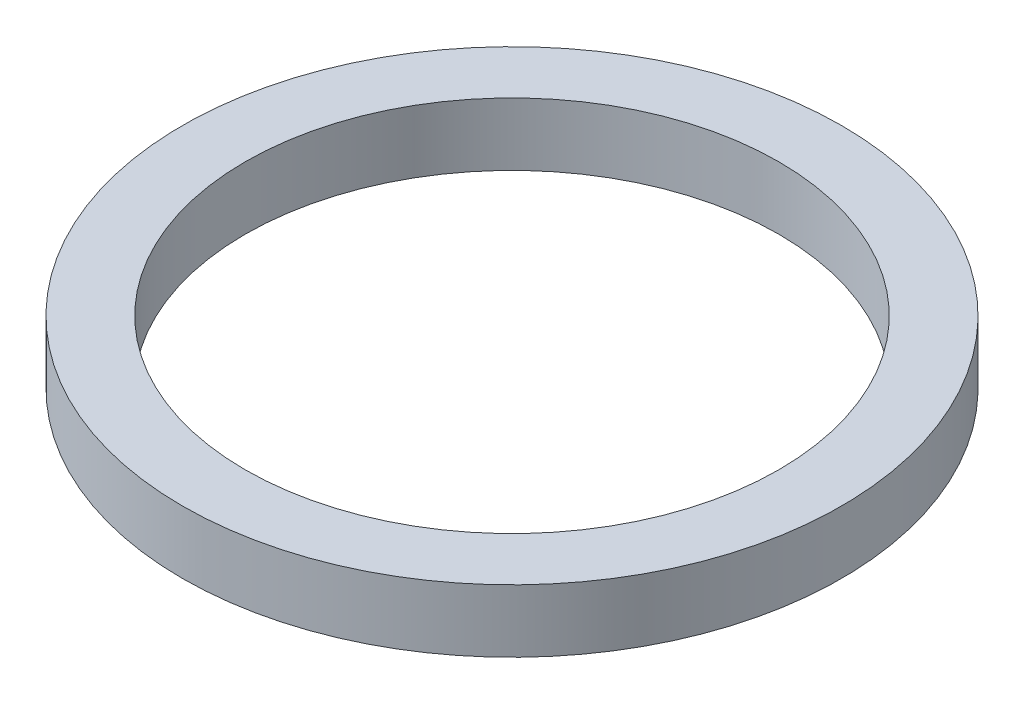
ISO-10303-21;
HEADER;
FILE_DESCRIPTION(('STEP AP214'),'2;1');
FILE_NAME('part.step','',(''),(''),'','','');
FILE_SCHEMA(('AUTOMOTIVE_DESIGN { 1 0 10303 214 1 1 1 1 }'));
ENDSEC;
DATA;
#1=APPLICATION_CONTEXT('core data for automotive mechanical design processes');
#2=APPLICATION_PROTOCOL_DEFINITION('international standard','automotive_design',2000,#1);
#3=PRODUCT_CONTEXT('',#1,'mechanical');
#4=PRODUCT('Part','Part','',(#3));
#5=PRODUCT_RELATED_PRODUCT_CATEGORY('part','',(#4));
#6=PRODUCT_DEFINITION_FORMATION('','',#4);
#7=PRODUCT_DEFINITION_CONTEXT('part definition',#1,'design');
#8=PRODUCT_DEFINITION('design','',#6,#7);
#9=PRODUCT_DEFINITION_SHAPE('','',#8);
#10=(LENGTH_UNIT() NAMED_UNIT(*) SI_UNIT(.MILLI.,.METRE.));
#11=(NAMED_UNIT(*) PLANE_ANGLE_UNIT() SI_UNIT($,.RADIAN.));
#12=(NAMED_UNIT(*) SI_UNIT($,.STERADIAN.) SOLID_ANGLE_UNIT());
#13=UNCERTAINTY_MEASURE_WITH_UNIT(LENGTH_MEASURE(1.E-05),#10,'distance_accuracy_value','');
#14=(GEOMETRIC_REPRESENTATION_CONTEXT(3) GLOBAL_UNCERTAINTY_ASSIGNED_CONTEXT((#13)) GLOBAL_UNIT_ASSIGNED_CONTEXT((#10,
#11,#12)) REPRESENTATION_CONTEXT('',''));
#15=CARTESIAN_POINT('',(0.,0.,0.));
#16=DIRECTION('',(0.,0.,1.));
#17=DIRECTION('',(1.,0.,0.));
#18=AXIS2_PLACEMENT_3D('',#15,#16,#17);
#19=CARTESIAN_POINT('',(0.,2.,0.));
#20=DIRECTION('',(0.,1.,0.));
#21=DIRECTION('',(0.,0.,1.));
#22=AXIS2_PLACEMENT_3D('',#19,#20,#21);
#23=PLANE('',#22);
#24=CARTESIAN_POINT('',(0.,2.,0.));
#25=DIRECTION('',(0.,1.,0.));
#26=DIRECTION('',(0.,0.,1.));
#27=AXIS2_PLACEMENT_3D('',#24,#25,#26);
#28=CIRCLE('',#27,10.5);
#29=CARTESIAN_POINT('',(0.,2.,10.5));
#30=VERTEX_POINT('',#29);
#31=EDGE_CURVE('E10',#30,#30,#28,.T.);
#32=ORIENTED_EDGE('',*,*,#31,.T.);
#33=EDGE_LOOP('',(#32));
#34=FACE_BOUND('',#33,.T.);
#35=CARTESIAN_POINT('',(0.,2.,0.));
#36=DIRECTION('',(0.,1.,0.));
#37=DIRECTION('',(0.,0.,1.));
#38=AXIS2_PLACEMENT_3D('',#35,#36,#37);
#39=CIRCLE('',#38,8.5);
#40=CARTESIAN_POINT('',(0.,2.,8.5));
#41=VERTEX_POINT('',#40);
#42=EDGE_CURVE('E54',#41,#41,#39,.T.);
#43=ORIENTED_EDGE('',*,*,#42,.F.);
#44=EDGE_LOOP('',(#43));
#45=FACE_BOUND('',#44,.T.);
#46=ADVANCED_FACE('F41',(#34,#45),#23,.T.);
#47=CARTESIAN_POINT('',(0.,0.,0.));
#48=DIRECTION('',(0.,1.,0.));
#49=DIRECTION('',(0.,0.,1.));
#50=AXIS2_PLACEMENT_3D('',#47,#48,#49);
#51=PLANE('',#50);
#52=CARTESIAN_POINT('',(0.,0.,0.));
#53=DIRECTION('',(0.,1.,0.));
#54=DIRECTION('',(0.,0.,1.));
#55=AXIS2_PLACEMENT_3D('',#52,#53,#54);
#56=CIRCLE('',#55,10.5);
#57=CARTESIAN_POINT('',(0.,0.,10.5));
#58=VERTEX_POINT('',#57);
#59=EDGE_CURVE('E45',#58,#58,#56,.T.);
#60=ORIENTED_EDGE('',*,*,#59,.F.);
#61=EDGE_LOOP('',(#60));
#62=FACE_BOUND('',#61,.T.);
#63=CARTESIAN_POINT('',(0.,0.,0.));
#64=DIRECTION('',(0.,1.,0.));
#65=DIRECTION('',(0.,0.,1.));
#66=AXIS2_PLACEMENT_3D('',#63,#64,#65);
#67=CIRCLE('',#66,8.5);
#68=CARTESIAN_POINT('',(0.,0.,8.5));
#69=VERTEX_POINT('',#68);
#70=EDGE_CURVE('E56',#69,#69,#67,.T.);
#71=ORIENTED_EDGE('',*,*,#70,.T.);
#72=EDGE_LOOP('',(#71));
#73=FACE_BOUND('',#72,.T.);
#74=ADVANCED_FACE('F68',(#62,#73),#51,.F.);
#75=CARTESIAN_POINT('',(0.,2.,0.));
#76=DIRECTION('',(0.,-1.,0.));
#77=DIRECTION('',(0.,0.,-1.));
#78=AXIS2_PLACEMENT_3D('',#75,#76,#77);
#79=CYLINDRICAL_SURFACE('',#78,10.5);
#80=ORIENTED_EDGE('',*,*,#31,.F.);
#81=EDGE_LOOP('',(#80));
#82=FACE_BOUND('',#81,.T.);
#83=ORIENTED_EDGE('',*,*,#59,.T.);
#84=EDGE_LOOP('',(#83));
#85=FACE_BOUND('',#84,.T.);
#86=ADVANCED_FACE('F43',(#82,#85),#79,.T.);
#87=CARTESIAN_POINT('',(0.,2.,0.));
#88=DIRECTION('',(0.,-1.,0.));
#89=DIRECTION('',(0.,0.,-1.));
#90=AXIS2_PLACEMENT_3D('',#87,#88,#89);
#91=CYLINDRICAL_SURFACE('',#90,8.5);
#92=ORIENTED_EDGE('',*,*,#42,.T.);
#93=EDGE_LOOP('',(#92));
#94=FACE_BOUND('',#93,.T.);
#95=ORIENTED_EDGE('',*,*,#70,.F.);
#96=EDGE_LOOP('',(#95));
#97=FACE_BOUND('',#96,.T.);
#98=ADVANCED_FACE('F64',(#94,#97),#91,.F.);
#99=CLOSED_SHELL('',(#46,#74,#86,#98));
#100=MANIFOLD_SOLID_BREP('B2',#99);
#101=ADVANCED_BREP_SHAPE_REPRESENTATION('',(#18,#100),#14);
#102=SHAPE_DEFINITION_REPRESENTATION(#9,#101);
ENDSEC;
END-ISO-10303-21;
